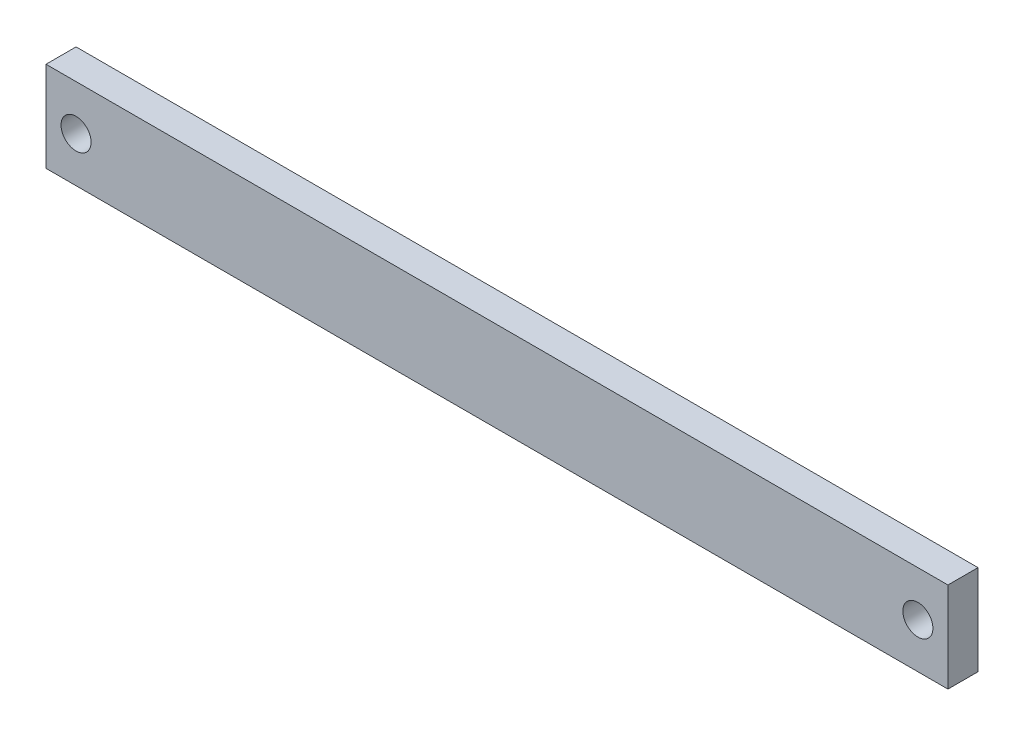
ISO-10303-21;
HEADER;
FILE_DESCRIPTION(('STEP AP214'),'2;1');
FILE_NAME('part.step','',(''),(''),'','','');
FILE_SCHEMA(('AUTOMOTIVE_DESIGN { 1 0 10303 214 1 1 1 1 }'));
ENDSEC;
DATA;
#1=APPLICATION_CONTEXT('core data for automotive mechanical design processes');
#2=APPLICATION_PROTOCOL_DEFINITION('international standard','automotive_design',2000,#1);
#3=PRODUCT_CONTEXT('',#1,'mechanical');
#4=PRODUCT('Part','Part','',(#3));
#5=PRODUCT_RELATED_PRODUCT_CATEGORY('part','',(#4));
#6=PRODUCT_DEFINITION_FORMATION('','',#4);
#7=PRODUCT_DEFINITION_CONTEXT('part definition',#1,'design');
#8=PRODUCT_DEFINITION('design','',#6,#7);
#9=PRODUCT_DEFINITION_SHAPE('','',#8);
#10=(LENGTH_UNIT() NAMED_UNIT(*) SI_UNIT(.MILLI.,.METRE.));
#11=(NAMED_UNIT(*) PLANE_ANGLE_UNIT() SI_UNIT($,.RADIAN.));
#12=(NAMED_UNIT(*) SI_UNIT($,.STERADIAN.) SOLID_ANGLE_UNIT());
#13=UNCERTAINTY_MEASURE_WITH_UNIT(LENGTH_MEASURE(1.E-05),#10,'distance_accuracy_value','');
#14=(GEOMETRIC_REPRESENTATION_CONTEXT(3) GLOBAL_UNCERTAINTY_ASSIGNED_CONTEXT((#13)) GLOBAL_UNIT_ASSIGNED_CONTEXT((#10,
#11,#12)) REPRESENTATION_CONTEXT('',''));
#15=CARTESIAN_POINT('',(0.,0.,0.));
#16=DIRECTION('',(0.,0.,1.));
#17=DIRECTION('',(1.,0.,0.));
#18=AXIS2_PLACEMENT_3D('',#15,#16,#17);
#19=CARTESIAN_POINT('',(0.,0.,5.));
#20=DIRECTION('',(0.,0.,-1.));
#21=DIRECTION('',(-1.,0.,0.));
#22=AXIS2_PLACEMENT_3D('',#19,#20,#21);
#23=PLANE('',#22);
#24=DIRECTION('',(0.,1.,0.));
#25=VECTOR('',#24,1.);
#26=CARTESIAN_POINT('',(75.,-7.5,5.));
#27=LINE('',#26,#25);
#28=CARTESIAN_POINT('',(75.,-7.5,5.));
#29=VERTEX_POINT('',#28);
#30=CARTESIAN_POINT('',(75.,7.5,5.));
#31=VERTEX_POINT('',#30);
#32=EDGE_CURVE('E91',#29,#31,#27,.T.);
#33=ORIENTED_EDGE('',*,*,#32,.T.);
#34=DIRECTION('',(-1.,0.,0.));
#35=VECTOR('',#34,1.);
#36=CARTESIAN_POINT('',(-75.,7.5,5.));
#37=LINE('',#36,#35);
#38=CARTESIAN_POINT('',(-75.,7.5,5.));
#39=VERTEX_POINT('',#38);
#40=EDGE_CURVE('E86',#31,#39,#37,.T.);
#41=ORIENTED_EDGE('',*,*,#40,.T.);
#42=DIRECTION('',(0.,-1.,0.));
#43=VECTOR('',#42,1.);
#44=CARTESIAN_POINT('',(-75.,-7.5,5.));
#45=LINE('',#44,#43);
#46=CARTESIAN_POINT('',(-75.,-7.5,5.));
#47=VERTEX_POINT('',#46);
#48=EDGE_CURVE('E89',#39,#47,#45,.T.);
#49=ORIENTED_EDGE('',*,*,#48,.T.);
#50=DIRECTION('',(1.,0.,0.));
#51=VECTOR('',#50,1.);
#52=CARTESIAN_POINT('',(-75.,-7.5,5.));
#53=LINE('',#52,#51);
#54=EDGE_CURVE('E56',#47,#29,#53,.T.);
#55=ORIENTED_EDGE('',*,*,#54,.T.);
#56=EDGE_LOOP('',(#33,#41,#49,#55));
#57=FACE_BOUND('',#56,.T.);
#58=CARTESIAN_POINT('',(70.,0.,5.));
#59=DIRECTION('',(0.,0.,1.));
#60=DIRECTION('',(1.,0.,0.));
#61=AXIS2_PLACEMENT_3D('',#58,#59,#60);
#62=CIRCLE('',#61,2.50000000000001);
#63=CARTESIAN_POINT('',(72.5,0.,5.));
#64=VERTEX_POINT('',#63);
#65=EDGE_CURVE('E106',#64,#64,#62,.T.);
#66=ORIENTED_EDGE('',*,*,#65,.F.);
#67=EDGE_LOOP('',(#66));
#68=FACE_BOUND('',#67,.T.);
#69=CARTESIAN_POINT('',(-70.,0.,5.));
#70=DIRECTION('',(0.,0.,1.));
#71=DIRECTION('',(1.,0.,0.));
#72=AXIS2_PLACEMENT_3D('',#69,#70,#71);
#73=CIRCLE('',#72,2.49999999999999);
#74=CARTESIAN_POINT('',(-67.5,0.,5.));
#75=VERTEX_POINT('',#74);
#76=EDGE_CURVE('E121',#75,#75,#73,.T.);
#77=ORIENTED_EDGE('',*,*,#76,.F.);
#78=EDGE_LOOP('',(#77));
#79=FACE_BOUND('',#78,.T.);
#80=ADVANCED_FACE('F39',(#57,#68,#79),#23,.F.);
#81=CARTESIAN_POINT('',(0.,0.,0.));
#82=DIRECTION('',(0.,0.,-1.));
#83=DIRECTION('',(-1.,0.,0.));
#84=AXIS2_PLACEMENT_3D('',#81,#82,#83);
#85=PLANE('',#84);
#86=CARTESIAN_POINT('',(70.,0.,0.));
#87=DIRECTION('',(0.,0.,1.));
#88=DIRECTION('',(1.,0.,0.));
#89=AXIS2_PLACEMENT_3D('',#86,#87,#88);
#90=CIRCLE('',#89,2.50000000000001);
#91=CARTESIAN_POINT('',(72.5,0.,0.));
#92=VERTEX_POINT('',#91);
#93=EDGE_CURVE('E118',#92,#92,#90,.T.);
#94=ORIENTED_EDGE('',*,*,#93,.T.);
#95=EDGE_LOOP('',(#94));
#96=FACE_BOUND('',#95,.T.);
#97=DIRECTION('',(0.,1.,0.));
#98=VECTOR('',#97,1.);
#99=CARTESIAN_POINT('',(75.,-7.5,0.));
#100=LINE('',#99,#98);
#101=CARTESIAN_POINT('',(75.,-7.5,0.));
#102=VERTEX_POINT('',#101);
#103=CARTESIAN_POINT('',(75.,7.5,0.));
#104=VERTEX_POINT('',#103);
#105=EDGE_CURVE('E103',#102,#104,#100,.T.);
#106=ORIENTED_EDGE('',*,*,#105,.F.);
#107=DIRECTION('',(1.,0.,0.));
#108=VECTOR('',#107,1.);
#109=CARTESIAN_POINT('',(-75.,-7.5,0.));
#110=LINE('',#109,#108);
#111=CARTESIAN_POINT('',(-75.,-7.5,0.));
#112=VERTEX_POINT('',#111);
#113=EDGE_CURVE('E79',#112,#102,#110,.T.);
#114=ORIENTED_EDGE('',*,*,#113,.F.);
#115=DIRECTION('',(0.,-1.,0.));
#116=VECTOR('',#115,1.);
#117=CARTESIAN_POINT('',(-75.,-7.5,0.));
#118=LINE('',#117,#116);
#119=CARTESIAN_POINT('',(-75.,7.5,0.));
#120=VERTEX_POINT('',#119);
#121=EDGE_CURVE('E73',#120,#112,#118,.T.);
#122=ORIENTED_EDGE('',*,*,#121,.F.);
#123=DIRECTION('',(-1.,0.,0.));
#124=VECTOR('',#123,1.);
#125=CARTESIAN_POINT('',(-75.,7.5,0.));
#126=LINE('',#125,#124);
#127=EDGE_CURVE('E95',#104,#120,#126,.T.);
#128=ORIENTED_EDGE('',*,*,#127,.F.);
#129=EDGE_LOOP('',(#106,#114,#122,#128));
#130=FACE_BOUND('',#129,.T.);
#131=CARTESIAN_POINT('',(-70.,0.,0.));
#132=DIRECTION('',(0.,0.,1.));
#133=DIRECTION('',(1.,0.,0.));
#134=AXIS2_PLACEMENT_3D('',#131,#132,#133);
#135=CIRCLE('',#134,2.49999999999999);
#136=CARTESIAN_POINT('',(-67.5,0.,0.));
#137=VERTEX_POINT('',#136);
#138=EDGE_CURVE('E124',#137,#137,#135,.T.);
#139=ORIENTED_EDGE('',*,*,#138,.T.);
#140=EDGE_LOOP('',(#139));
#141=FACE_BOUND('',#140,.T.);
#142=ADVANCED_FACE('F114',(#96,#130,#141),#85,.T.);
#143=CARTESIAN_POINT('',(75.,-7.5,5.));
#144=DIRECTION('',(-1.,0.,0.));
#145=DIRECTION('',(0.,0.,1.));
#146=AXIS2_PLACEMENT_3D('',#143,#144,#145);
#147=PLANE('',#146);
#148=ORIENTED_EDGE('',*,*,#105,.T.);
#149=DIRECTION('',(0.,0.,-1.));
#150=VECTOR('',#149,1.);
#151=CARTESIAN_POINT('',(75.,7.5,5.));
#152=LINE('',#151,#150);
#153=EDGE_CURVE('E11',#31,#104,#152,.T.);
#154=ORIENTED_EDGE('',*,*,#153,.F.);
#155=ORIENTED_EDGE('',*,*,#32,.F.);
#156=DIRECTION('',(0.,0.,-1.));
#157=VECTOR('',#156,1.);
#158=CARTESIAN_POINT('',(75.,-7.5,5.));
#159=LINE('',#158,#157);
#160=EDGE_CURVE('E99',#29,#102,#159,.T.);
#161=ORIENTED_EDGE('',*,*,#160,.T.);
#162=EDGE_LOOP('',(#148,#154,#155,#161));
#163=FACE_BOUND('',#162,.T.);
#164=ADVANCED_FACE('F41',(#163),#147,.F.);
#165=CARTESIAN_POINT('',(-75.,7.5,5.));
#166=DIRECTION('',(0.,-1.,0.));
#167=DIRECTION('',(0.,0.,-1.));
#168=AXIS2_PLACEMENT_3D('',#165,#166,#167);
#169=PLANE('',#168);
#170=ORIENTED_EDGE('',*,*,#127,.T.);
#171=DIRECTION('',(0.,0.,-1.));
#172=VECTOR('',#171,1.);
#173=CARTESIAN_POINT('',(-75.,7.5,5.));
#174=LINE('',#173,#172);
#175=EDGE_CURVE('E48',#39,#120,#174,.T.);
#176=ORIENTED_EDGE('',*,*,#175,.F.);
#177=ORIENTED_EDGE('',*,*,#40,.F.);
#178=ORIENTED_EDGE('',*,*,#153,.T.);
#179=EDGE_LOOP('',(#170,#176,#177,#178));
#180=FACE_BOUND('',#179,.T.);
#181=ADVANCED_FACE('F94',(#180),#169,.F.);
#182=CARTESIAN_POINT('',(-75.,-7.5,5.));
#183=DIRECTION('',(1.,0.,0.));
#184=DIRECTION('',(0.,0.,-1.));
#185=AXIS2_PLACEMENT_3D('',#182,#183,#184);
#186=PLANE('',#185);
#187=ORIENTED_EDGE('',*,*,#121,.T.);
#188=DIRECTION('',(0.,0.,-1.));
#189=VECTOR('',#188,1.);
#190=CARTESIAN_POINT('',(-75.,-7.5,5.));
#191=LINE('',#190,#189);
#192=EDGE_CURVE('E96',#47,#112,#191,.T.);
#193=ORIENTED_EDGE('',*,*,#192,.F.);
#194=ORIENTED_EDGE('',*,*,#48,.F.);
#195=ORIENTED_EDGE('',*,*,#175,.T.);
#196=EDGE_LOOP('',(#187,#193,#194,#195));
#197=FACE_BOUND('',#196,.T.);
#198=ADVANCED_FACE('F97',(#197),#186,.F.);
#199=CARTESIAN_POINT('',(-75.,-7.5,5.));
#200=DIRECTION('',(0.,1.,0.));
#201=DIRECTION('',(0.,0.,1.));
#202=AXIS2_PLACEMENT_3D('',#199,#200,#201);
#203=PLANE('',#202);
#204=ORIENTED_EDGE('',*,*,#113,.T.);
#205=ORIENTED_EDGE('',*,*,#160,.F.);
#206=ORIENTED_EDGE('',*,*,#54,.F.);
#207=ORIENTED_EDGE('',*,*,#192,.T.);
#208=EDGE_LOOP('',(#204,#205,#206,#207));
#209=FACE_BOUND('',#208,.T.);
#210=ADVANCED_FACE('F111',(#209),#203,.F.);
#211=CARTESIAN_POINT('',(70.,0.,5.));
#212=DIRECTION('',(0.,0.,-1.));
#213=DIRECTION('',(-1.,0.,0.));
#214=AXIS2_PLACEMENT_3D('',#211,#212,#213);
#215=CYLINDRICAL_SURFACE('',#214,2.50000000000001);
#216=ORIENTED_EDGE('',*,*,#65,.T.);
#217=EDGE_LOOP('',(#216));
#218=FACE_BOUND('',#217,.T.);
#219=ORIENTED_EDGE('',*,*,#93,.F.);
#220=EDGE_LOOP('',(#219));
#221=FACE_BOUND('',#220,.T.);
#222=ADVANCED_FACE('F141',(#218,#221),#215,.F.);
#223=CARTESIAN_POINT('',(-70.,0.,5.));
#224=DIRECTION('',(0.,0.,-1.));
#225=DIRECTION('',(-1.,0.,0.));
#226=AXIS2_PLACEMENT_3D('',#223,#224,#225);
#227=CYLINDRICAL_SURFACE('',#226,2.49999999999999);
#228=ORIENTED_EDGE('',*,*,#76,.T.);
#229=EDGE_LOOP('',(#228));
#230=FACE_BOUND('',#229,.T.);
#231=ORIENTED_EDGE('',*,*,#138,.F.);
#232=EDGE_LOOP('',(#231));
#233=FACE_BOUND('',#232,.T.);
#234=ADVANCED_FACE('F130',(#230,#233),#227,.F.);
#235=CLOSED_SHELL('',(#80,#142,#164,#181,#198,#210,#222,#234));
#236=MANIFOLD_SOLID_BREP('B2',#235);
#237=ADVANCED_BREP_SHAPE_REPRESENTATION('',(#18,#236),#14);
#238=SHAPE_DEFINITION_REPRESENTATION(#9,#237);
ENDSEC;
END-ISO-10303-21;
